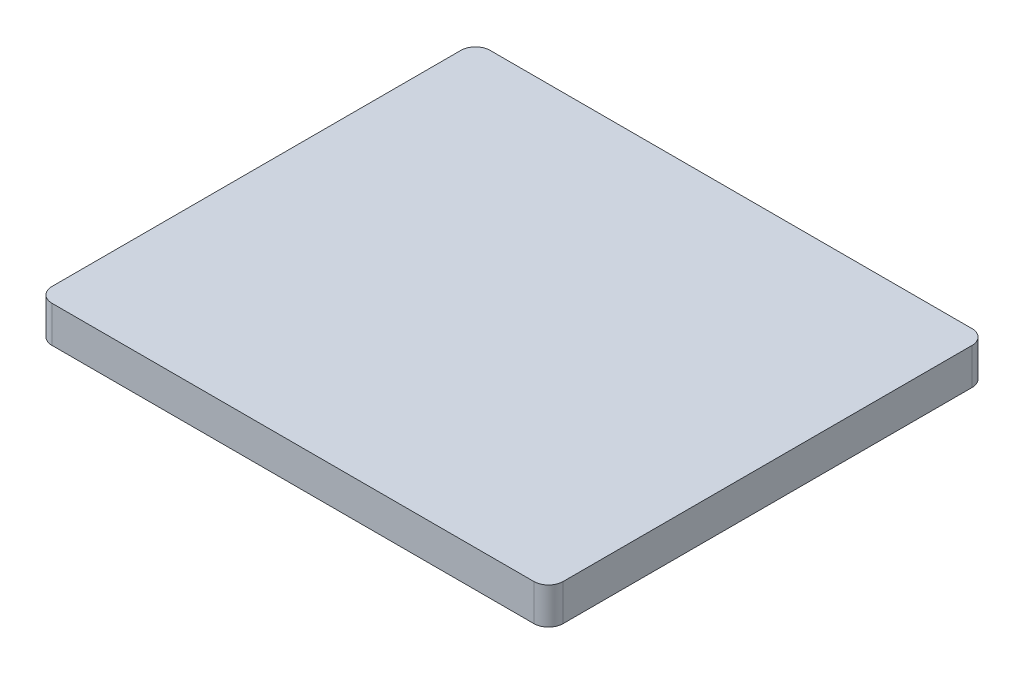
ISO-10303-21;
HEADER;
FILE_DESCRIPTION(('STEP AP214'),'2;1');
FILE_NAME('part.step','',(''),(''),'','','');
FILE_SCHEMA(('AUTOMOTIVE_DESIGN { 1 0 10303 214 1 1 1 1 }'));
ENDSEC;
DATA;
#1=APPLICATION_CONTEXT('core data for automotive mechanical design processes');
#2=APPLICATION_PROTOCOL_DEFINITION('international standard','automotive_design',2000,#1);
#3=PRODUCT_CONTEXT('',#1,'mechanical');
#4=PRODUCT('Part','Part','',(#3));
#5=PRODUCT_RELATED_PRODUCT_CATEGORY('part','',(#4));
#6=PRODUCT_DEFINITION_FORMATION('','',#4);
#7=PRODUCT_DEFINITION_CONTEXT('part definition',#1,'design');
#8=PRODUCT_DEFINITION('design','',#6,#7);
#9=PRODUCT_DEFINITION_SHAPE('','',#8);
#10=(LENGTH_UNIT() NAMED_UNIT(*) SI_UNIT(.MILLI.,.METRE.));
#11=(NAMED_UNIT(*) PLANE_ANGLE_UNIT() SI_UNIT($,.RADIAN.));
#12=(NAMED_UNIT(*) SI_UNIT($,.STERADIAN.) SOLID_ANGLE_UNIT());
#13=UNCERTAINTY_MEASURE_WITH_UNIT(LENGTH_MEASURE(1.E-05),#10,'distance_accuracy_value','');
#14=(GEOMETRIC_REPRESENTATION_CONTEXT(3) GLOBAL_UNCERTAINTY_ASSIGNED_CONTEXT((#13)) GLOBAL_UNIT_ASSIGNED_CONTEXT((#10,
#11,#12)) REPRESENTATION_CONTEXT('',''));
#15=CARTESIAN_POINT('',(0.,0.,0.));
#16=DIRECTION('',(0.,0.,1.));
#17=DIRECTION('',(1.,0.,0.));
#18=AXIS2_PLACEMENT_3D('',#15,#16,#17);
#19=CARTESIAN_POINT('',(0.,0.,0.));
#20=DIRECTION('',(0.,1.,0.));
#21=DIRECTION('',(0.,0.,1.));
#22=AXIS2_PLACEMENT_3D('',#19,#20,#21);
#23=PLANE('',#22);
#24=DIRECTION('',(1.,0.,0.));
#25=VECTOR('',#24,1.);
#26=CARTESIAN_POINT('',(0.,0.,30.));
#27=LINE('',#26,#25);
#28=CARTESIAN_POINT('',(-33.,0.,30.));
#29=VERTEX_POINT('',#28);
#30=CARTESIAN_POINT('',(33.,0.,30.));
#31=VERTEX_POINT('',#30);
#32=EDGE_CURVE('E319',#29,#31,#27,.T.);
#33=ORIENTED_EDGE('',*,*,#32,.F.);
#34=CARTESIAN_POINT('',(-33.,0.,28.));
#35=DIRECTION('',(0.,1.,0.));
#36=DIRECTION('',(0.,0.,1.));
#37=AXIS2_PLACEMENT_3D('',#34,#35,#36);
#38=CIRCLE('',#37,2.);
#39=CARTESIAN_POINT('',(-35.,0.,28.));
#40=VERTEX_POINT('',#39);
#41=EDGE_CURVE('E357',#29,#40,#38,.F.);
#42=ORIENTED_EDGE('',*,*,#41,.T.);
#43=DIRECTION('',(0.,0.,1.));
#44=VECTOR('',#43,1.);
#45=CARTESIAN_POINT('',(-35.,0.,0.));
#46=LINE('',#45,#44);
#47=CARTESIAN_POINT('',(-35.,0.,-28.));
#48=VERTEX_POINT('',#47);
#49=EDGE_CURVE('E330',#48,#40,#46,.T.);
#50=ORIENTED_EDGE('',*,*,#49,.F.);
#51=CARTESIAN_POINT('',(-33.,0.,-28.));
#52=DIRECTION('',(0.,1.,0.));
#53=DIRECTION('',(0.,0.,1.));
#54=AXIS2_PLACEMENT_3D('',#51,#52,#53);
#55=CIRCLE('',#54,2.);
#56=CARTESIAN_POINT('',(-33.,0.,-30.));
#57=VERTEX_POINT('',#56);
#58=EDGE_CURVE('E197',#48,#57,#55,.F.);
#59=ORIENTED_EDGE('',*,*,#58,.T.);
#60=DIRECTION('',(1.,0.,0.));
#61=VECTOR('',#60,1.);
#62=CARTESIAN_POINT('',(0.,0.,-30.));
#63=LINE('',#62,#61);
#64=CARTESIAN_POINT('',(33.,0.,-30.));
#65=VERTEX_POINT('',#64);
#66=EDGE_CURVE('E192',#57,#65,#63,.T.);
#67=ORIENTED_EDGE('',*,*,#66,.T.);
#68=CARTESIAN_POINT('',(33.,0.,-28.));
#69=DIRECTION('',(0.,1.,0.));
#70=DIRECTION('',(0.,0.,1.));
#71=AXIS2_PLACEMENT_3D('',#68,#69,#70);
#72=CIRCLE('',#71,2.);
#73=CARTESIAN_POINT('',(35.,0.,-28.));
#74=VERTEX_POINT('',#73);
#75=EDGE_CURVE('E186',#65,#74,#72,.F.);
#76=ORIENTED_EDGE('',*,*,#75,.T.);
#77=DIRECTION('',(0.,0.,1.));
#78=VECTOR('',#77,1.);
#79=CARTESIAN_POINT('',(35.,0.,0.));
#80=LINE('',#79,#78);
#81=CARTESIAN_POINT('',(35.,0.,28.));
#82=VERTEX_POINT('',#81);
#83=EDGE_CURVE('E190',#74,#82,#80,.T.);
#84=ORIENTED_EDGE('',*,*,#83,.T.);
#85=CARTESIAN_POINT('',(33.,0.,28.));
#86=DIRECTION('',(0.,1.,0.));
#87=DIRECTION('',(0.,0.,1.));
#88=AXIS2_PLACEMENT_3D('',#85,#86,#87);
#89=CIRCLE('',#88,2.);
#90=EDGE_CURVE('E355',#82,#31,#89,.F.);
#91=ORIENTED_EDGE('',*,*,#90,.T.);
#92=EDGE_LOOP('',(#33,#42,#50,#59,#67,#76,#84,#91));
#93=FACE_BOUND('',#92,.T.);
#94=CARTESIAN_POINT('',(12.5,0.,-2.5));
#95=DIRECTION('',(0.,1.,0.));
#96=DIRECTION('',(0.,0.,1.));
#97=AXIS2_PLACEMENT_3D('',#94,#95,#96);
#98=CIRCLE('',#97,4.);
#99=CARTESIAN_POINT('',(12.5,0.,-6.5));
#100=VERTEX_POINT('',#99);
#101=CARTESIAN_POINT('',(16.5,0.,-2.5));
#102=VERTEX_POINT('',#101);
#103=EDGE_CURVE('E198',#100,#102,#98,.F.);
#104=ORIENTED_EDGE('',*,*,#103,.F.);
#105=DIRECTION('',(-1.,0.,0.));
#106=VECTOR('',#105,1.);
#107=CARTESIAN_POINT('',(0.,0.,-6.5));
#108=LINE('',#107,#106);
#109=CARTESIAN_POINT('',(-12.5,0.,-6.5));
#110=VERTEX_POINT('',#109);
#111=EDGE_CURVE('E349',#100,#110,#108,.T.);
#112=ORIENTED_EDGE('',*,*,#111,.T.);
#113=CARTESIAN_POINT('',(-12.5,0.,-2.5));
#114=DIRECTION('',(0.,1.,0.));
#115=DIRECTION('',(0.,0.,1.));
#116=AXIS2_PLACEMENT_3D('',#113,#114,#115);
#117=CIRCLE('',#116,4.);
#118=CARTESIAN_POINT('',(-16.5,0.,-2.5));
#119=VERTEX_POINT('',#118);
#120=EDGE_CURVE('E346',#119,#110,#117,.F.);
#121=ORIENTED_EDGE('',*,*,#120,.F.);
#122=DIRECTION('',(0.,0.,1.));
#123=VECTOR('',#122,1.);
#124=CARTESIAN_POINT('',(-16.5,0.,0.));
#125=LINE('',#124,#123);
#126=CARTESIAN_POINT('',(-16.5,0.,2.5));
#127=VERTEX_POINT('',#126);
#128=EDGE_CURVE('E342',#119,#127,#125,.T.);
#129=ORIENTED_EDGE('',*,*,#128,.T.);
#130=CARTESIAN_POINT('',(-12.5,0.,2.5));
#131=DIRECTION('',(0.,1.,0.));
#132=DIRECTION('',(0.,0.,1.));
#133=AXIS2_PLACEMENT_3D('',#130,#131,#132);
#134=CIRCLE('',#133,4.);
#135=CARTESIAN_POINT('',(-12.5,0.,6.5));
#136=VERTEX_POINT('',#135);
#137=EDGE_CURVE('E339',#136,#127,#134,.F.);
#138=ORIENTED_EDGE('',*,*,#137,.F.);
#139=DIRECTION('',(1.,0.,0.));
#140=VECTOR('',#139,1.);
#141=CARTESIAN_POINT('',(0.,0.,6.5));
#142=LINE('',#141,#140);
#143=CARTESIAN_POINT('',(12.5,0.,6.5));
#144=VERTEX_POINT('',#143);
#145=EDGE_CURVE('E337',#136,#144,#142,.T.);
#146=ORIENTED_EDGE('',*,*,#145,.T.);
#147=CARTESIAN_POINT('',(12.5,0.,2.5));
#148=DIRECTION('',(0.,1.,0.));
#149=DIRECTION('',(0.,0.,1.));
#150=AXIS2_PLACEMENT_3D('',#147,#148,#149);
#151=CIRCLE('',#150,4.);
#152=CARTESIAN_POINT('',(16.5,0.,2.5));
#153=VERTEX_POINT('',#152);
#154=EDGE_CURVE('E327',#153,#144,#151,.F.);
#155=ORIENTED_EDGE('',*,*,#154,.F.);
#156=DIRECTION('',(0.,0.,-1.));
#157=VECTOR('',#156,1.);
#158=CARTESIAN_POINT('',(16.5,0.,0.));
#159=LINE('',#158,#157);
#160=EDGE_CURVE('E344',#153,#102,#159,.T.);
#161=ORIENTED_EDGE('',*,*,#160,.T.);
#162=EDGE_LOOP('',(#104,#112,#121,#129,#138,#146,#155,#161));
#163=FACE_BOUND('',#162,.T.);
#164=ADVANCED_FACE('F38',(#93,#163),#23,.F.);
#165=CARTESIAN_POINT('',(35.,5.,0.));
#166=DIRECTION('',(1.,0.,0.));
#167=DIRECTION('',(0.,0.,-1.));
#168=AXIS2_PLACEMENT_3D('',#165,#166,#167);
#169=PLANE('',#168);
#170=DIRECTION('',(0.,0.,1.));
#171=VECTOR('',#170,1.);
#172=CARTESIAN_POINT('',(35.,5.,0.));
#173=LINE('',#172,#171);
#174=CARTESIAN_POINT('',(35.,5.,-28.));
#175=VERTEX_POINT('',#174);
#176=CARTESIAN_POINT('',(35.,5.,28.));
#177=VERTEX_POINT('',#176);
#178=EDGE_CURVE('E316',#175,#177,#173,.T.);
#179=ORIENTED_EDGE('',*,*,#178,.T.);
#180=DIRECTION('',(0.,-1.,0.));
#181=VECTOR('',#180,1.);
#182=CARTESIAN_POINT('',(35.,0.,28.));
#183=LINE('',#182,#181);
#184=EDGE_CURVE('E207',#177,#82,#183,.T.);
#185=ORIENTED_EDGE('',*,*,#184,.T.);
#186=ORIENTED_EDGE('',*,*,#83,.F.);
#187=DIRECTION('',(0.,-1.,0.));
#188=VECTOR('',#187,1.);
#189=CARTESIAN_POINT('',(35.,5.,-28.));
#190=LINE('',#189,#188);
#191=EDGE_CURVE('E204',#74,#175,#190,.F.);
#192=ORIENTED_EDGE('',*,*,#191,.T.);
#193=EDGE_LOOP('',(#179,#185,#186,#192));
#194=FACE_BOUND('',#193,.T.);
#195=ADVANCED_FACE('F203',(#194),#169,.T.);
#196=CARTESIAN_POINT('',(0.,5.,-30.));
#197=DIRECTION('',(0.,0.,-1.));
#198=DIRECTION('',(-1.,0.,0.));
#199=AXIS2_PLACEMENT_3D('',#196,#197,#198);
#200=PLANE('',#199);
#201=ORIENTED_EDGE('',*,*,#66,.F.);
#202=DIRECTION('',(0.,-1.,0.));
#203=VECTOR('',#202,1.);
#204=CARTESIAN_POINT('',(-33.,5.,-30.));
#205=LINE('',#204,#203);
#206=CARTESIAN_POINT('',(-33.,5.,-30.));
#207=VERTEX_POINT('',#206);
#208=EDGE_CURVE('E221',#57,#207,#205,.F.);
#209=ORIENTED_EDGE('',*,*,#208,.T.);
#210=DIRECTION('',(1.,0.,0.));
#211=VECTOR('',#210,1.);
#212=CARTESIAN_POINT('',(0.,5.,-30.));
#213=LINE('',#212,#211);
#214=CARTESIAN_POINT('',(33.,5.,-30.));
#215=VERTEX_POINT('',#214);
#216=EDGE_CURVE('E318',#207,#215,#213,.T.);
#217=ORIENTED_EDGE('',*,*,#216,.T.);
#218=DIRECTION('',(0.,-1.,0.));
#219=VECTOR('',#218,1.);
#220=CARTESIAN_POINT('',(33.,5.,-30.));
#221=LINE('',#220,#219);
#222=EDGE_CURVE('E214',#215,#65,#221,.T.);
#223=ORIENTED_EDGE('',*,*,#222,.T.);
#224=EDGE_LOOP('',(#201,#209,#217,#223));
#225=FACE_BOUND('',#224,.T.);
#226=ADVANCED_FACE('F422',(#225),#200,.T.);
#227=CARTESIAN_POINT('',(-35.,5.,0.));
#228=DIRECTION('',(1.,0.,0.));
#229=DIRECTION('',(0.,0.,-1.));
#230=AXIS2_PLACEMENT_3D('',#227,#228,#229);
#231=PLANE('',#230);
#232=ORIENTED_EDGE('',*,*,#49,.T.);
#233=DIRECTION('',(0.,-1.,0.));
#234=VECTOR('',#233,1.);
#235=CARTESIAN_POINT('',(-35.,5.,28.));
#236=LINE('',#235,#234);
#237=CARTESIAN_POINT('',(-35.,5.,28.));
#238=VERTEX_POINT('',#237);
#239=EDGE_CURVE('E394',#40,#238,#236,.F.);
#240=ORIENTED_EDGE('',*,*,#239,.T.);
#241=DIRECTION('',(0.,0.,1.));
#242=VECTOR('',#241,1.);
#243=CARTESIAN_POINT('',(-35.,5.,0.));
#244=LINE('',#243,#242);
#245=CARTESIAN_POINT('',(-35.,5.,-28.));
#246=VERTEX_POINT('',#245);
#247=EDGE_CURVE('E322',#246,#238,#244,.T.);
#248=ORIENTED_EDGE('',*,*,#247,.F.);
#249=DIRECTION('',(0.,-1.,0.));
#250=VECTOR('',#249,1.);
#251=CARTESIAN_POINT('',(-35.,0.,-28.));
#252=LINE('',#251,#250);
#253=EDGE_CURVE('E391',#246,#48,#252,.T.);
#254=ORIENTED_EDGE('',*,*,#253,.T.);
#255=EDGE_LOOP('',(#232,#240,#248,#254));
#256=FACE_BOUND('',#255,.T.);
#257=ADVANCED_FACE('F414',(#256),#231,.F.);
#258=CARTESIAN_POINT('',(0.,5.,30.));
#259=DIRECTION('',(0.,0.,-1.));
#260=DIRECTION('',(-1.,0.,0.));
#261=AXIS2_PLACEMENT_3D('',#258,#259,#260);
#262=PLANE('',#261);
#263=DIRECTION('',(1.,0.,0.));
#264=VECTOR('',#263,1.);
#265=CARTESIAN_POINT('',(0.,5.,30.));
#266=LINE('',#265,#264);
#267=CARTESIAN_POINT('',(-33.,5.,30.));
#268=VERTEX_POINT('',#267);
#269=CARTESIAN_POINT('',(33.,5.,30.));
#270=VERTEX_POINT('',#269);
#271=EDGE_CURVE('E325',#268,#270,#266,.T.);
#272=ORIENTED_EDGE('',*,*,#271,.F.);
#273=DIRECTION('',(0.,-1.,0.));
#274=VECTOR('',#273,1.);
#275=CARTESIAN_POINT('',(-33.,5.,30.));
#276=LINE('',#275,#274);
#277=EDGE_CURVE('E388',#268,#29,#276,.T.);
#278=ORIENTED_EDGE('',*,*,#277,.T.);
#279=ORIENTED_EDGE('',*,*,#32,.T.);
#280=DIRECTION('',(0.,-1.,0.));
#281=VECTOR('',#280,1.);
#282=CARTESIAN_POINT('',(33.,5.,30.));
#283=LINE('',#282,#281);
#284=EDGE_CURVE('E386',#31,#270,#283,.F.);
#285=ORIENTED_EDGE('',*,*,#284,.T.);
#286=EDGE_LOOP('',(#272,#278,#279,#285));
#287=FACE_BOUND('',#286,.T.);
#288=ADVANCED_FACE('F406',(#287),#262,.F.);
#289=CARTESIAN_POINT('',(0.,5.,0.));
#290=DIRECTION('',(0.,1.,0.));
#291=DIRECTION('',(0.,0.,1.));
#292=AXIS2_PLACEMENT_3D('',#289,#290,#291);
#293=PLANE('',#292);
#294=ORIENTED_EDGE('',*,*,#247,.T.);
#295=CARTESIAN_POINT('',(-33.,5.,28.));
#296=DIRECTION('',(0.,1.,0.));
#297=DIRECTION('',(0.,0.,1.));
#298=AXIS2_PLACEMENT_3D('',#295,#296,#297);
#299=CIRCLE('',#298,2.);
#300=EDGE_CURVE('E212',#238,#268,#299,.T.);
#301=ORIENTED_EDGE('',*,*,#300,.T.);
#302=ORIENTED_EDGE('',*,*,#271,.T.);
#303=CARTESIAN_POINT('',(33.,5.,28.));
#304=DIRECTION('',(0.,1.,0.));
#305=DIRECTION('',(0.,0.,1.));
#306=AXIS2_PLACEMENT_3D('',#303,#304,#305);
#307=CIRCLE('',#306,2.);
#308=EDGE_CURVE('E216',#270,#177,#307,.T.);
#309=ORIENTED_EDGE('',*,*,#308,.T.);
#310=ORIENTED_EDGE('',*,*,#178,.F.);
#311=CARTESIAN_POINT('',(33.,5.,-28.));
#312=DIRECTION('',(0.,1.,0.));
#313=DIRECTION('',(0.,0.,1.));
#314=AXIS2_PLACEMENT_3D('',#311,#312,#313);
#315=CIRCLE('',#314,2.);
#316=EDGE_CURVE('E211',#175,#215,#315,.T.);
#317=ORIENTED_EDGE('',*,*,#316,.T.);
#318=ORIENTED_EDGE('',*,*,#216,.F.);
#319=CARTESIAN_POINT('',(-33.,5.,-28.));
#320=DIRECTION('',(0.,1.,0.));
#321=DIRECTION('',(0.,0.,1.));
#322=AXIS2_PLACEMENT_3D('',#319,#320,#321);
#323=CIRCLE('',#322,2.);
#324=EDGE_CURVE('E397',#207,#246,#323,.T.);
#325=ORIENTED_EDGE('',*,*,#324,.T.);
#326=EDGE_LOOP('',(#294,#301,#302,#309,#310,#317,#318,#325));
#327=FACE_BOUND('',#326,.T.);
#328=ADVANCED_FACE('F400',(#327),#293,.T.);
#329=CARTESIAN_POINT('',(-14.5,-20.,-4.5));
#330=DIRECTION('',(-1.,0.,0.));
#331=DIRECTION('',(0.,0.,1.));
#332=AXIS2_PLACEMENT_3D('',#329,#330,#331);
#333=PLANE('',#332);
#334=DIRECTION('',(0.,0.,1.));
#335=VECTOR('',#334,1.);
#336=CARTESIAN_POINT('',(-14.5,-2.,-4.5));
#337=LINE('',#336,#335);
#338=CARTESIAN_POINT('',(-14.5,-2.,2.5));
#339=VERTEX_POINT('',#338);
#340=CARTESIAN_POINT('',(-14.5,-2.,-2.5));
#341=VERTEX_POINT('',#340);
#342=EDGE_CURVE('E381',#339,#341,#337,.F.);
#343=ORIENTED_EDGE('',*,*,#342,.T.);
#344=DIRECTION('',(0.,1.,0.));
#345=VECTOR('',#344,1.);
#346=CARTESIAN_POINT('',(-14.5,-20.,-2.5));
#347=LINE('',#346,#345);
#348=CARTESIAN_POINT('',(-14.5,-18.,-2.5));
#349=VERTEX_POINT('',#348);
#350=EDGE_CURVE('E384',#341,#349,#347,.F.);
#351=ORIENTED_EDGE('',*,*,#350,.T.);
#352=DIRECTION('',(0.,0.,1.));
#353=VECTOR('',#352,1.);
#354=CARTESIAN_POINT('',(-14.5,-18.,-4.5));
#355=LINE('',#354,#353);
#356=CARTESIAN_POINT('',(-14.5,-18.,2.5));
#357=VERTEX_POINT('',#356);
#358=EDGE_CURVE('E379',#349,#357,#355,.T.);
#359=ORIENTED_EDGE('',*,*,#358,.T.);
#360=DIRECTION('',(0.,1.,0.));
#361=VECTOR('',#360,1.);
#362=CARTESIAN_POINT('',(-14.5,-20.,2.5));
#363=LINE('',#362,#361);
#364=EDGE_CURVE('E377',#357,#339,#363,.T.);
#365=ORIENTED_EDGE('',*,*,#364,.T.);
#366=EDGE_LOOP('',(#343,#351,#359,#365));
#367=FACE_BOUND('',#366,.T.);
#368=ADVANCED_FACE('F443',(#367),#333,.T.);
#369=CARTESIAN_POINT('',(14.5,-20.,-4.5));
#370=DIRECTION('',(0.,0.,-1.));
#371=DIRECTION('',(-1.,0.,0.));
#372=AXIS2_PLACEMENT_3D('',#369,#370,#371);
#373=PLANE('',#372);
#374=DIRECTION('',(-1.,0.,0.));
#375=VECTOR('',#374,1.);
#376=CARTESIAN_POINT('',(14.5,-2.,-4.5));
#377=LINE('',#376,#375);
#378=CARTESIAN_POINT('',(-12.5,-2.,-4.5));
#379=VERTEX_POINT('',#378);
#380=CARTESIAN_POINT('',(12.5,-2.,-4.5));
#381=VERTEX_POINT('',#380);
#382=EDGE_CURVE('E363',#379,#381,#377,.F.);
#383=ORIENTED_EDGE('',*,*,#382,.T.);
#384=DIRECTION('',(0.,1.,0.));
#385=VECTOR('',#384,1.);
#386=CARTESIAN_POINT('',(12.5,-20.,-4.5));
#387=LINE('',#386,#385);
#388=CARTESIAN_POINT('',(12.5,-18.,-4.5));
#389=VERTEX_POINT('',#388);
#390=EDGE_CURVE('E366',#381,#389,#387,.F.);
#391=ORIENTED_EDGE('',*,*,#390,.T.);
#392=DIRECTION('',(-1.,0.,0.));
#393=VECTOR('',#392,1.);
#394=CARTESIAN_POINT('',(14.5,-18.,-4.5));
#395=LINE('',#394,#393);
#396=CARTESIAN_POINT('',(-12.5,-18.,-4.5));
#397=VERTEX_POINT('',#396);
#398=EDGE_CURVE('E361',#389,#397,#395,.T.);
#399=ORIENTED_EDGE('',*,*,#398,.T.);
#400=DIRECTION('',(0.,1.,0.));
#401=VECTOR('',#400,1.);
#402=CARTESIAN_POINT('',(-12.5,-20.,-4.5));
#403=LINE('',#402,#401);
#404=EDGE_CURVE('E359',#397,#379,#403,.T.);
#405=ORIENTED_EDGE('',*,*,#404,.T.);
#406=EDGE_LOOP('',(#383,#391,#399,#405));
#407=FACE_BOUND('',#406,.T.);
#408=CARTESIAN_POINT('',(0.,-12.,-4.5));
#409=DIRECTION('',(0.,0.,-1.));
#410=DIRECTION('',(-1.,0.,0.));
#411=AXIS2_PLACEMENT_3D('',#408,#409,#410);
#412=CIRCLE('',#411,5.5);
#413=CARTESIAN_POINT('',(-5.5,-12.,-4.5));
#414=VERTEX_POINT('',#413);
#415=EDGE_CURVE('E208',#414,#414,#412,.T.);
#416=ORIENTED_EDGE('',*,*,#415,.F.);
#417=EDGE_LOOP('',(#416));
#418=FACE_BOUND('',#417,.T.);
#419=ADVANCED_FACE('F447',(#407,#418),#373,.T.);
#420=CARTESIAN_POINT('',(14.5,-20.,-4.5));
#421=DIRECTION('',(1.,0.,0.));
#422=DIRECTION('',(0.,0.,-1.));
#423=AXIS2_PLACEMENT_3D('',#420,#421,#422);
#424=PLANE('',#423);
#425=DIRECTION('',(0.,1.,0.));
#426=VECTOR('',#425,1.);
#427=CARTESIAN_POINT('',(14.5,-20.,-2.5));
#428=LINE('',#427,#426);
#429=CARTESIAN_POINT('',(14.5,-18.,-2.5));
#430=VERTEX_POINT('',#429);
#431=CARTESIAN_POINT('',(14.5,-2.,-2.5));
#432=VERTEX_POINT('',#431);
#433=EDGE_CURVE('E370',#430,#432,#428,.T.);
#434=ORIENTED_EDGE('',*,*,#433,.T.);
#435=DIRECTION('',(0.,0.,-1.));
#436=VECTOR('',#435,1.);
#437=CARTESIAN_POINT('',(14.5,-2.,-4.5));
#438=LINE('',#437,#436);
#439=CARTESIAN_POINT('',(14.5,-2.,2.5));
#440=VERTEX_POINT('',#439);
#441=EDGE_CURVE('E374',#432,#440,#438,.F.);
#442=ORIENTED_EDGE('',*,*,#441,.T.);
#443=DIRECTION('',(0.,1.,0.));
#444=VECTOR('',#443,1.);
#445=CARTESIAN_POINT('',(14.5,-20.,2.5));
#446=LINE('',#445,#444);
#447=CARTESIAN_POINT('',(14.5,-18.,2.5));
#448=VERTEX_POINT('',#447);
#449=EDGE_CURVE('E372',#440,#448,#446,.F.);
#450=ORIENTED_EDGE('',*,*,#449,.T.);
#451=DIRECTION('',(0.,0.,-1.));
#452=VECTOR('',#451,1.);
#453=CARTESIAN_POINT('',(14.5,-18.,-4.5));
#454=LINE('',#453,#452);
#455=EDGE_CURVE('E368',#448,#430,#454,.T.);
#456=ORIENTED_EDGE('',*,*,#455,.T.);
#457=EDGE_LOOP('',(#434,#442,#450,#456));
#458=FACE_BOUND('',#457,.T.);
#459=ADVANCED_FACE('F452',(#458),#424,.T.);
#460=CARTESIAN_POINT('',(14.5,-20.,4.5));
#461=DIRECTION('',(0.,0.,1.));
#462=DIRECTION('',(1.,0.,0.));
#463=AXIS2_PLACEMENT_3D('',#460,#461,#462);
#464=PLANE('',#463);
#465=DIRECTION('',(0.,1.,0.));
#466=VECTOR('',#465,1.);
#467=CARTESIAN_POINT('',(-12.5,-20.,4.5));
#468=LINE('',#467,#466);
#469=CARTESIAN_POINT('',(-12.5,-2.,4.5));
#470=VERTEX_POINT('',#469);
#471=CARTESIAN_POINT('',(-12.5,-18.,4.5));
#472=VERTEX_POINT('',#471);
#473=EDGE_CURVE('E223',#470,#472,#468,.F.);
#474=ORIENTED_EDGE('',*,*,#473,.T.);
#475=DIRECTION('',(1.,0.,0.));
#476=VECTOR('',#475,1.);
#477=CARTESIAN_POINT('',(14.5,-18.,4.5));
#478=LINE('',#477,#476);
#479=CARTESIAN_POINT('',(12.5,-18.,4.5));
#480=VERTEX_POINT('',#479);
#481=EDGE_CURVE('E229',#472,#480,#478,.T.);
#482=ORIENTED_EDGE('',*,*,#481,.T.);
#483=DIRECTION('',(0.,1.,0.));
#484=VECTOR('',#483,1.);
#485=CARTESIAN_POINT('',(12.5,-20.,4.5));
#486=LINE('',#485,#484);
#487=CARTESIAN_POINT('',(12.5,-2.,4.5));
#488=VERTEX_POINT('',#487);
#489=EDGE_CURVE('E227',#480,#488,#486,.T.);
#490=ORIENTED_EDGE('',*,*,#489,.T.);
#491=DIRECTION('',(1.,0.,0.));
#492=VECTOR('',#491,1.);
#493=CARTESIAN_POINT('',(14.5,-2.,4.5));
#494=LINE('',#493,#492);
#495=EDGE_CURVE('E225',#488,#470,#494,.F.);
#496=ORIENTED_EDGE('',*,*,#495,.T.);
#497=EDGE_LOOP('',(#474,#482,#490,#496));
#498=FACE_BOUND('',#497,.T.);
#499=CARTESIAN_POINT('',(0.,-12.,4.5));
#500=DIRECTION('',(0.,0.,1.));
#501=DIRECTION('',(1.,0.,0.));
#502=AXIS2_PLACEMENT_3D('',#499,#500,#501);
#503=CIRCLE('',#502,5.5);
#504=CARTESIAN_POINT('',(5.5,-12.,4.5));
#505=VERTEX_POINT('',#504);
#506=EDGE_CURVE('E304',#505,#505,#503,.T.);
#507=ORIENTED_EDGE('',*,*,#506,.F.);
#508=EDGE_LOOP('',(#507));
#509=FACE_BOUND('',#508,.T.);
#510=ADVANCED_FACE('F456',(#498,#509),#464,.T.);
#511=CARTESIAN_POINT('',(0.,-20.,0.));
#512=DIRECTION('',(0.,-1.,0.));
#513=DIRECTION('',(0.,0.,-1.));
#514=AXIS2_PLACEMENT_3D('',#511,#512,#513);
#515=PLANE('',#514);
#516=DIRECTION('',(-1.,0.,0.));
#517=VECTOR('',#516,1.);
#518=CARTESIAN_POINT('',(0.,-20.,-2.5));
#519=LINE('',#518,#517);
#520=CARTESIAN_POINT('',(-12.5,-20.,-2.5));
#521=VERTEX_POINT('',#520);
#522=CARTESIAN_POINT('',(12.5,-20.,-2.5));
#523=VERTEX_POINT('',#522);
#524=EDGE_CURVE('E58',#521,#523,#519,.F.);
#525=ORIENTED_EDGE('',*,*,#524,.T.);
#526=DIRECTION('',(0.,0.,-1.));
#527=VECTOR('',#526,1.);
#528=CARTESIAN_POINT('',(12.5,-20.,0.));
#529=LINE('',#528,#527);
#530=CARTESIAN_POINT('',(12.5,-20.,2.5));
#531=VERTEX_POINT('',#530);
#532=EDGE_CURVE('E11',#523,#531,#529,.F.);
#533=ORIENTED_EDGE('',*,*,#532,.T.);
#534=DIRECTION('',(1.,0.,0.));
#535=VECTOR('',#534,1.);
#536=CARTESIAN_POINT('',(0.,-20.,2.5));
#537=LINE('',#536,#535);
#538=CARTESIAN_POINT('',(-12.5,-20.,2.5));
#539=VERTEX_POINT('',#538);
#540=EDGE_CURVE('E47',#531,#539,#537,.F.);
#541=ORIENTED_EDGE('',*,*,#540,.T.);
#542=DIRECTION('',(0.,0.,1.));
#543=VECTOR('',#542,1.);
#544=CARTESIAN_POINT('',(-12.5,-20.,0.));
#545=LINE('',#544,#543);
#546=EDGE_CURVE('E232',#539,#521,#545,.F.);
#547=ORIENTED_EDGE('',*,*,#546,.T.);
#548=EDGE_LOOP('',(#525,#533,#541,#547));
#549=FACE_BOUND('',#548,.T.);
#550=ADVANCED_FACE('F459',(#549),#515,.T.);
#551=CARTESIAN_POINT('',(0.,-12.,-30.));
#552=DIRECTION('',(0.,0.,1.));
#553=DIRECTION('',(1.,0.,0.));
#554=AXIS2_PLACEMENT_3D('',#551,#552,#553);
#555=CYLINDRICAL_SURFACE('',#554,5.5);
#556=ORIENTED_EDGE('',*,*,#415,.T.);
#557=EDGE_LOOP('',(#556));
#558=FACE_BOUND('',#557,.T.);
#559=ORIENTED_EDGE('',*,*,#506,.T.);
#560=EDGE_LOOP('',(#559));
#561=FACE_BOUND('',#560,.T.);
#562=ADVANCED_FACE('F466',(#558,#561),#555,.F.);
#563=CARTESIAN_POINT('',(14.5,-18.,2.5));
#564=DIRECTION('',(1.,0.,0.));
#565=DIRECTION('',(0.,0.,-1.));
#566=AXIS2_PLACEMENT_3D('',#563,#564,#565);
#567=CYLINDRICAL_SURFACE('',#566,2.);
#568=CARTESIAN_POINT('',(12.5,-18.,2.5));
#569=DIRECTION('',(1.,0.,0.));
#570=DIRECTION('',(0.,0.,-1.));
#571=AXIS2_PLACEMENT_3D('',#568,#569,#570);
#572=CIRCLE('',#571,2.);
#573=EDGE_CURVE('E42',#480,#531,#572,.T.);
#574=ORIENTED_EDGE('',*,*,#573,.F.);
#575=ORIENTED_EDGE('',*,*,#481,.F.);
#576=CARTESIAN_POINT('',(-12.5,-18.,2.5));
#577=DIRECTION('',(-1.,0.,0.));
#578=DIRECTION('',(0.,0.,1.));
#579=AXIS2_PLACEMENT_3D('',#576,#577,#578);
#580=CIRCLE('',#579,2.);
#581=EDGE_CURVE('E297',#539,#472,#580,.T.);
#582=ORIENTED_EDGE('',*,*,#581,.F.);
#583=ORIENTED_EDGE('',*,*,#540,.F.);
#584=EDGE_LOOP('',(#574,#575,#582,#583));
#585=FACE_BOUND('',#584,.T.);
#586=ADVANCED_FACE('F468',(#585),#567,.T.);
#587=CARTESIAN_POINT('',(12.5,-18.,2.5));
#588=DIRECTION('',(0.,0.,1.));
#589=DIRECTION('',(1.,0.,0.));
#590=AXIS2_PLACEMENT_3D('',#587,#588,#589);
#591=SPHERICAL_SURFACE('',#590,2.);
#592=CARTESIAN_POINT('',(12.5,-18.,2.5));
#593=DIRECTION('',(0.,-1.,0.));
#594=DIRECTION('',(0.,0.,-1.));
#595=AXIS2_PLACEMENT_3D('',#592,#593,#594);
#596=CIRCLE('',#595,2.);
#597=EDGE_CURVE('E292',#480,#448,#596,.F.);
#598=ORIENTED_EDGE('',*,*,#597,.F.);
#599=ORIENTED_EDGE('',*,*,#573,.T.);
#600=CARTESIAN_POINT('',(12.5,-18.,2.5));
#601=DIRECTION('',(0.,0.,1.));
#602=DIRECTION('',(1.,0.,0.));
#603=AXIS2_PLACEMENT_3D('',#600,#601,#602);
#604=CIRCLE('',#603,2.);
#605=EDGE_CURVE('E295',#448,#531,#604,.F.);
#606=ORIENTED_EDGE('',*,*,#605,.F.);
#607=EDGE_LOOP('',(#598,#599,#606));
#608=FACE_BOUND('',#607,.T.);
#609=ADVANCED_FACE('F473',(#608),#591,.T.);
#610=CARTESIAN_POINT('',(-12.5,-18.,2.5));
#611=DIRECTION('',(0.,0.,1.));
#612=DIRECTION('',(1.,0.,0.));
#613=AXIS2_PLACEMENT_3D('',#610,#611,#612);
#614=SPHERICAL_SURFACE('',#613,2.);
#615=CARTESIAN_POINT('',(-12.5,-18.,2.5));
#616=DIRECTION('',(0.,0.,1.));
#617=DIRECTION('',(1.,0.,0.));
#618=AXIS2_PLACEMENT_3D('',#615,#616,#617);
#619=CIRCLE('',#618,2.);
#620=EDGE_CURVE('E286',#539,#357,#619,.F.);
#621=ORIENTED_EDGE('',*,*,#620,.F.);
#622=ORIENTED_EDGE('',*,*,#581,.T.);
#623=CARTESIAN_POINT('',(-12.5,-18.,2.5));
#624=DIRECTION('',(0.,-1.,0.));
#625=DIRECTION('',(0.,0.,-1.));
#626=AXIS2_PLACEMENT_3D('',#623,#624,#625);
#627=CIRCLE('',#626,2.);
#628=EDGE_CURVE('E289',#357,#472,#627,.F.);
#629=ORIENTED_EDGE('',*,*,#628,.F.);
#630=EDGE_LOOP('',(#621,#622,#629));
#631=FACE_BOUND('',#630,.T.);
#632=ADVANCED_FACE('F481',(#631),#614,.T.);
#633=CARTESIAN_POINT('',(12.5,-18.,-4.5));
#634=DIRECTION('',(0.,0.,-1.));
#635=DIRECTION('',(-1.,0.,0.));
#636=AXIS2_PLACEMENT_3D('',#633,#634,#635);
#637=CYLINDRICAL_SURFACE('',#636,2.);
#638=ORIENTED_EDGE('',*,*,#605,.T.);
#639=ORIENTED_EDGE('',*,*,#532,.F.);
#640=CARTESIAN_POINT('',(12.5,-18.,-2.5));
#641=DIRECTION('',(0.,0.,-1.));
#642=DIRECTION('',(-1.,0.,0.));
#643=AXIS2_PLACEMENT_3D('',#640,#641,#642);
#644=CIRCLE('',#643,2.);
#645=EDGE_CURVE('E280',#430,#523,#644,.T.);
#646=ORIENTED_EDGE('',*,*,#645,.F.);
#647=ORIENTED_EDGE('',*,*,#455,.F.);
#648=EDGE_LOOP('',(#638,#639,#646,#647));
#649=FACE_BOUND('',#648,.T.);
#650=ADVANCED_FACE('F673',(#649),#637,.T.);
#651=CARTESIAN_POINT('',(12.5,-20.,2.5));
#652=DIRECTION('',(0.,1.,0.));
#653=DIRECTION('',(0.,0.,1.));
#654=AXIS2_PLACEMENT_3D('',#651,#652,#653);
#655=CYLINDRICAL_SURFACE('',#654,2.);
#656=ORIENTED_EDGE('',*,*,#597,.T.);
#657=ORIENTED_EDGE('',*,*,#449,.F.);
#658=CARTESIAN_POINT('',(12.5,-2.,2.5));
#659=DIRECTION('',(0.,1.,0.));
#660=DIRECTION('',(0.,0.,1.));
#661=AXIS2_PLACEMENT_3D('',#658,#659,#660);
#662=CIRCLE('',#661,2.);
#663=EDGE_CURVE('E277',#488,#440,#662,.T.);
#664=ORIENTED_EDGE('',*,*,#663,.F.);
#665=ORIENTED_EDGE('',*,*,#489,.F.);
#666=EDGE_LOOP('',(#656,#657,#664,#665));
#667=FACE_BOUND('',#666,.T.);
#668=ADVANCED_FACE('F663',(#667),#655,.T.);
#669=CARTESIAN_POINT('',(0.,-2.,6.5));
#670=DIRECTION('',(1.,0.,0.));
#671=DIRECTION('',(0.,0.,-1.));
#672=AXIS2_PLACEMENT_3D('',#669,#670,#671);
#673=CYLINDRICAL_SURFACE('',#672,2.);
#674=CARTESIAN_POINT('',(-12.5,-2.,6.5));
#675=DIRECTION('',(1.,0.,0.));
#676=DIRECTION('',(0.,0.,-1.));
#677=AXIS2_PLACEMENT_3D('',#674,#675,#676);
#678=CIRCLE('',#677,2.);
#679=EDGE_CURVE('E271',#470,#136,#678,.T.);
#680=ORIENTED_EDGE('',*,*,#679,.F.);
#681=ORIENTED_EDGE('',*,*,#495,.F.);
#682=CARTESIAN_POINT('',(12.5,-2.,6.5));
#683=DIRECTION('',(-1.,0.,0.));
#684=DIRECTION('',(0.,0.,1.));
#685=AXIS2_PLACEMENT_3D('',#682,#683,#684);
#686=CIRCLE('',#685,2.);
#687=EDGE_CURVE('E274',#144,#488,#686,.T.);
#688=ORIENTED_EDGE('',*,*,#687,.F.);
#689=ORIENTED_EDGE('',*,*,#145,.F.);
#690=EDGE_LOOP('',(#680,#681,#688,#689));
#691=FACE_BOUND('',#690,.T.);
#692=ADVANCED_FACE('F653',(#691),#673,.F.);
#693=CARTESIAN_POINT('',(-12.5,-20.,2.5));
#694=DIRECTION('',(0.,1.,0.));
#695=DIRECTION('',(0.,0.,1.));
#696=AXIS2_PLACEMENT_3D('',#693,#694,#695);
#697=CYLINDRICAL_SURFACE('',#696,2.);
#698=ORIENTED_EDGE('',*,*,#628,.T.);
#699=ORIENTED_EDGE('',*,*,#473,.F.);
#700=CARTESIAN_POINT('',(-12.5,-2.,2.5));
#701=DIRECTION('',(0.,1.,0.));
#702=DIRECTION('',(0.,0.,1.));
#703=AXIS2_PLACEMENT_3D('',#700,#701,#702);
#704=CIRCLE('',#703,2.);
#705=EDGE_CURVE('E268',#339,#470,#704,.T.);
#706=ORIENTED_EDGE('',*,*,#705,.F.);
#707=ORIENTED_EDGE('',*,*,#364,.F.);
#708=EDGE_LOOP('',(#698,#699,#706,#707));
#709=FACE_BOUND('',#708,.T.);
#710=ADVANCED_FACE('F643',(#709),#697,.T.);
#711=CARTESIAN_POINT('',(-12.5,-18.,-4.5));
#712=DIRECTION('',(0.,0.,1.));
#713=DIRECTION('',(1.,0.,0.));
#714=AXIS2_PLACEMENT_3D('',#711,#712,#713);
#715=CYLINDRICAL_SURFACE('',#714,2.);
#716=ORIENTED_EDGE('',*,*,#620,.T.);
#717=ORIENTED_EDGE('',*,*,#358,.F.);
#718=CARTESIAN_POINT('',(-12.5,-18.,-2.5));
#719=DIRECTION('',(0.,0.,-1.));
#720=DIRECTION('',(-1.,0.,0.));
#721=AXIS2_PLACEMENT_3D('',#718,#719,#720);
#722=CIRCLE('',#721,2.);
#723=EDGE_CURVE('E265',#521,#349,#722,.T.);
#724=ORIENTED_EDGE('',*,*,#723,.F.);
#725=ORIENTED_EDGE('',*,*,#546,.F.);
#726=EDGE_LOOP('',(#716,#717,#724,#725));
#727=FACE_BOUND('',#726,.T.);
#728=ADVANCED_FACE('F633',(#727),#715,.T.);
#729=CARTESIAN_POINT('',(14.5,-18.,-2.5));
#730=DIRECTION('',(-1.,0.,0.));
#731=DIRECTION('',(0.,0.,1.));
#732=AXIS2_PLACEMENT_3D('',#729,#730,#731);
#733=CYLINDRICAL_SURFACE('',#732,2.);
#734=CARTESIAN_POINT('',(12.5,-18.,-2.5));
#735=DIRECTION('',(1.,0.,0.));
#736=DIRECTION('',(0.,0.,-1.));
#737=AXIS2_PLACEMENT_3D('',#734,#735,#736);
#738=CIRCLE('',#737,2.);
#739=EDGE_CURVE('E283',#523,#389,#738,.T.);
#740=ORIENTED_EDGE('',*,*,#739,.F.);
#741=ORIENTED_EDGE('',*,*,#524,.F.);
#742=CARTESIAN_POINT('',(-12.5,-18.,-2.5));
#743=DIRECTION('',(-1.,0.,0.));
#744=DIRECTION('',(0.,-1.,0.));
#745=AXIS2_PLACEMENT_3D('',#742,#743,#744);
#746=CIRCLE('',#745,2.);
#747=EDGE_CURVE('E262',#397,#521,#746,.T.);
#748=ORIENTED_EDGE('',*,*,#747,.F.);
#749=ORIENTED_EDGE('',*,*,#398,.F.);
#750=EDGE_LOOP('',(#740,#741,#748,#749));
#751=FACE_BOUND('',#750,.T.);
#752=ADVANCED_FACE('F623',(#751),#733,.T.);
#753=CARTESIAN_POINT('',(12.5,-18.,-2.5));
#754=DIRECTION('',(0.,0.,1.));
#755=DIRECTION('',(1.,0.,0.));
#756=AXIS2_PLACEMENT_3D('',#753,#754,#755);
#757=SPHERICAL_SURFACE('',#756,2.);
#758=ORIENTED_EDGE('',*,*,#645,.T.);
#759=ORIENTED_EDGE('',*,*,#739,.T.);
#760=CARTESIAN_POINT('',(12.5,-18.,-2.5));
#761=DIRECTION('',(0.,-1.,0.));
#762=DIRECTION('',(0.,0.,-1.));
#763=AXIS2_PLACEMENT_3D('',#760,#761,#762);
#764=CIRCLE('',#763,2.);
#765=EDGE_CURVE('E259',#430,#389,#764,.F.);
#766=ORIENTED_EDGE('',*,*,#765,.F.);
#767=EDGE_LOOP('',(#758,#759,#766));
#768=FACE_BOUND('',#767,.T.);
#769=ADVANCED_FACE('F613',(#768),#757,.T.);
#770=CARTESIAN_POINT('',(12.5,-2.,2.5));
#771=DIRECTION('',(0.,1.,0.));
#772=DIRECTION('',(0.,0.,1.));
#773=AXIS2_PLACEMENT_3D('',#770,#771,#772);
#774=TOROIDAL_SURFACE('',#773,4.,2.);
#775=ORIENTED_EDGE('',*,*,#687,.T.);
#776=ORIENTED_EDGE('',*,*,#663,.T.);
#777=CARTESIAN_POINT('',(16.5,-2.,2.5));
#778=DIRECTION('',(0.,0.,-1.));
#779=DIRECTION('',(-1.,0.,0.));
#780=AXIS2_PLACEMENT_3D('',#777,#778,#779);
#781=CIRCLE('',#780,2.);
#782=EDGE_CURVE('E257',#153,#440,#781,.F.);
#783=ORIENTED_EDGE('',*,*,#782,.F.);
#784=ORIENTED_EDGE('',*,*,#154,.T.);
#785=EDGE_LOOP('',(#775,#776,#783,#784));
#786=FACE_BOUND('',#785,.T.);
#787=ADVANCED_FACE('F603',(#786),#774,.F.);
#788=CARTESIAN_POINT('',(-12.5,-2.,2.5));
#789=DIRECTION('',(0.,1.,0.));
#790=DIRECTION('',(0.,0.,1.));
#791=AXIS2_PLACEMENT_3D('',#788,#789,#790);
#792=TOROIDAL_SURFACE('',#791,4.,2.);
#793=ORIENTED_EDGE('',*,*,#679,.T.);
#794=ORIENTED_EDGE('',*,*,#137,.T.);
#795=CARTESIAN_POINT('',(-16.5,-2.,2.5));
#796=DIRECTION('',(0.,0.,-1.));
#797=DIRECTION('',(-1.,0.,0.));
#798=AXIS2_PLACEMENT_3D('',#795,#796,#797);
#799=CIRCLE('',#798,2.);
#800=EDGE_CURVE('E254',#339,#127,#799,.F.);
#801=ORIENTED_EDGE('',*,*,#800,.F.);
#802=ORIENTED_EDGE('',*,*,#705,.T.);
#803=EDGE_LOOP('',(#793,#794,#801,#802));
#804=FACE_BOUND('',#803,.T.);
#805=ADVANCED_FACE('F593',(#804),#792,.F.);
#806=CARTESIAN_POINT('',(-12.5,-18.,-2.5));
#807=DIRECTION('',(0.,0.,1.));
#808=DIRECTION('',(1.,0.,0.));
#809=AXIS2_PLACEMENT_3D('',#806,#807,#808);
#810=SPHERICAL_SURFACE('',#809,2.);
#811=ORIENTED_EDGE('',*,*,#747,.T.);
#812=ORIENTED_EDGE('',*,*,#723,.T.);
#813=CARTESIAN_POINT('',(-12.5,-18.,-2.5));
#814=DIRECTION('',(0.,-1.,0.));
#815=DIRECTION('',(0.,0.,-1.));
#816=AXIS2_PLACEMENT_3D('',#813,#814,#815);
#817=CIRCLE('',#816,2.);
#818=EDGE_CURVE('E251',#397,#349,#817,.F.);
#819=ORIENTED_EDGE('',*,*,#818,.F.);
#820=EDGE_LOOP('',(#811,#812,#819));
#821=FACE_BOUND('',#820,.T.);
#822=ADVANCED_FACE('F582',(#821),#810,.T.);
#823=CARTESIAN_POINT('',(12.5,-20.,-2.5));
#824=DIRECTION('',(0.,1.,0.));
#825=DIRECTION('',(0.,0.,1.));
#826=AXIS2_PLACEMENT_3D('',#823,#824,#825);
#827=CYLINDRICAL_SURFACE('',#826,2.);
#828=ORIENTED_EDGE('',*,*,#765,.T.);
#829=ORIENTED_EDGE('',*,*,#390,.F.);
#830=CARTESIAN_POINT('',(12.5,-2.,-2.5));
#831=DIRECTION('',(0.,1.,0.));
#832=DIRECTION('',(0.,0.,1.));
#833=AXIS2_PLACEMENT_3D('',#830,#831,#832);
#834=CIRCLE('',#833,2.);
#835=EDGE_CURVE('E248',#432,#381,#834,.T.);
#836=ORIENTED_EDGE('',*,*,#835,.F.);
#837=ORIENTED_EDGE('',*,*,#433,.F.);
#838=EDGE_LOOP('',(#828,#829,#836,#837));
#839=FACE_BOUND('',#838,.T.);
#840=ADVANCED_FACE('F572',(#839),#827,.T.);
#841=CARTESIAN_POINT('',(16.5,-2.,0.));
#842=DIRECTION('',(0.,0.,-1.));
#843=DIRECTION('',(-1.,0.,0.));
#844=AXIS2_PLACEMENT_3D('',#841,#842,#843);
#845=CYLINDRICAL_SURFACE('',#844,2.);
#846=ORIENTED_EDGE('',*,*,#782,.T.);
#847=ORIENTED_EDGE('',*,*,#441,.F.);
#848=CARTESIAN_POINT('',(16.5,-2.,-2.5));
#849=DIRECTION('',(0.,0.,1.));
#850=DIRECTION('',(1.,0.,0.));
#851=AXIS2_PLACEMENT_3D('',#848,#849,#850);
#852=CIRCLE('',#851,2.);
#853=EDGE_CURVE('E245',#102,#432,#852,.T.);
#854=ORIENTED_EDGE('',*,*,#853,.F.);
#855=ORIENTED_EDGE('',*,*,#160,.F.);
#856=EDGE_LOOP('',(#846,#847,#854,#855));
#857=FACE_BOUND('',#856,.T.);
#858=ADVANCED_FACE('F562',(#857),#845,.F.);
#859=CARTESIAN_POINT('',(-16.5,-2.,0.));
#860=DIRECTION('',(0.,0.,1.));
#861=DIRECTION('',(1.,0.,0.));
#862=AXIS2_PLACEMENT_3D('',#859,#860,#861);
#863=CYLINDRICAL_SURFACE('',#862,2.);
#864=ORIENTED_EDGE('',*,*,#800,.T.);
#865=ORIENTED_EDGE('',*,*,#128,.F.);
#866=CARTESIAN_POINT('',(-16.5,-2.,-2.5));
#867=DIRECTION('',(0.,0.,1.));
#868=DIRECTION('',(1.,0.,0.));
#869=AXIS2_PLACEMENT_3D('',#866,#867,#868);
#870=CIRCLE('',#869,2.);
#871=EDGE_CURVE('E242',#341,#119,#870,.T.);
#872=ORIENTED_EDGE('',*,*,#871,.F.);
#873=ORIENTED_EDGE('',*,*,#342,.F.);
#874=EDGE_LOOP('',(#864,#865,#872,#873));
#875=FACE_BOUND('',#874,.T.);
#876=ADVANCED_FACE('F551',(#875),#863,.F.);
#877=CARTESIAN_POINT('',(-12.5,-20.,-2.5));
#878=DIRECTION('',(0.,1.,0.));
#879=DIRECTION('',(0.,0.,1.));
#880=AXIS2_PLACEMENT_3D('',#877,#878,#879);
#881=CYLINDRICAL_SURFACE('',#880,2.);
#882=ORIENTED_EDGE('',*,*,#818,.T.);
#883=ORIENTED_EDGE('',*,*,#350,.F.);
#884=CARTESIAN_POINT('',(-12.5,-2.,-2.5));
#885=DIRECTION('',(0.,1.,0.));
#886=DIRECTION('',(0.,0.,1.));
#887=AXIS2_PLACEMENT_3D('',#884,#885,#886);
#888=CIRCLE('',#887,2.);
#889=EDGE_CURVE('E240',#379,#341,#888,.T.);
#890=ORIENTED_EDGE('',*,*,#889,.F.);
#891=ORIENTED_EDGE('',*,*,#404,.F.);
#892=EDGE_LOOP('',(#882,#883,#890,#891));
#893=FACE_BOUND('',#892,.T.);
#894=ADVANCED_FACE('F541',(#893),#881,.T.);
#895=CARTESIAN_POINT('',(12.5,-2.,-2.5));
#896=DIRECTION('',(0.,1.,0.));
#897=DIRECTION('',(0.,0.,1.));
#898=AXIS2_PLACEMENT_3D('',#895,#896,#897);
#899=TOROIDAL_SURFACE('',#898,4.,2.);
#900=ORIENTED_EDGE('',*,*,#853,.T.);
#901=ORIENTED_EDGE('',*,*,#835,.T.);
#902=CARTESIAN_POINT('',(12.5,-2.,-6.5));
#903=DIRECTION('',(-1.,0.,0.));
#904=DIRECTION('',(0.,0.,1.));
#905=AXIS2_PLACEMENT_3D('',#902,#903,#904);
#906=CIRCLE('',#905,2.);
#907=EDGE_CURVE('E238',#100,#381,#906,.F.);
#908=ORIENTED_EDGE('',*,*,#907,.F.);
#909=ORIENTED_EDGE('',*,*,#103,.T.);
#910=EDGE_LOOP('',(#900,#901,#908,#909));
#911=FACE_BOUND('',#910,.T.);
#912=ADVANCED_FACE('F531',(#911),#899,.F.);
#913=CARTESIAN_POINT('',(-12.5,-2.,-2.5));
#914=DIRECTION('',(0.,1.,0.));
#915=DIRECTION('',(0.,0.,1.));
#916=AXIS2_PLACEMENT_3D('',#913,#914,#915);
#917=TOROIDAL_SURFACE('',#916,4.,2.);
#918=ORIENTED_EDGE('',*,*,#871,.T.);
#919=ORIENTED_EDGE('',*,*,#120,.T.);
#920=CARTESIAN_POINT('',(-12.5,-2.,-6.5));
#921=DIRECTION('',(1.,0.,0.));
#922=DIRECTION('',(0.,0.,-1.));
#923=AXIS2_PLACEMENT_3D('',#920,#921,#922);
#924=CIRCLE('',#923,2.);
#925=EDGE_CURVE('E236',#379,#110,#924,.F.);
#926=ORIENTED_EDGE('',*,*,#925,.F.);
#927=ORIENTED_EDGE('',*,*,#889,.T.);
#928=EDGE_LOOP('',(#918,#919,#926,#927));
#929=FACE_BOUND('',#928,.T.);
#930=ADVANCED_FACE('F520',(#929),#917,.F.);
#931=CARTESIAN_POINT('',(0.,-2.,-6.5));
#932=DIRECTION('',(-1.,0.,0.));
#933=DIRECTION('',(0.,0.,1.));
#934=AXIS2_PLACEMENT_3D('',#931,#932,#933);
#935=CYLINDRICAL_SURFACE('',#934,2.);
#936=ORIENTED_EDGE('',*,*,#907,.T.);
#937=ORIENTED_EDGE('',*,*,#382,.F.);
#938=ORIENTED_EDGE('',*,*,#925,.T.);
#939=ORIENTED_EDGE('',*,*,#111,.F.);
#940=EDGE_LOOP('',(#936,#937,#938,#939));
#941=FACE_BOUND('',#940,.T.);
#942=ADVANCED_FACE('F487',(#941),#935,.F.);
#943=CARTESIAN_POINT('',(-33.,5.,28.));
#944=DIRECTION('',(0.,-1.,0.));
#945=DIRECTION('',(0.,0.,-1.));
#946=AXIS2_PLACEMENT_3D('',#943,#944,#945);
#947=CYLINDRICAL_SURFACE('',#946,2.);
#948=ORIENTED_EDGE('',*,*,#300,.F.);
#949=ORIENTED_EDGE('',*,*,#239,.F.);
#950=ORIENTED_EDGE('',*,*,#41,.F.);
#951=ORIENTED_EDGE('',*,*,#277,.F.);
#952=EDGE_LOOP('',(#948,#949,#950,#951));
#953=FACE_BOUND('',#952,.T.);
#954=ADVANCED_FACE('F410',(#953),#947,.T.);
#955=CARTESIAN_POINT('',(33.,5.,28.));
#956=DIRECTION('',(0.,1.,0.));
#957=DIRECTION('',(0.,0.,1.));
#958=AXIS2_PLACEMENT_3D('',#955,#956,#957);
#959=CYLINDRICAL_SURFACE('',#958,2.);
#960=ORIENTED_EDGE('',*,*,#308,.F.);
#961=ORIENTED_EDGE('',*,*,#284,.F.);
#962=ORIENTED_EDGE('',*,*,#90,.F.);
#963=ORIENTED_EDGE('',*,*,#184,.F.);
#964=EDGE_LOOP('',(#960,#961,#962,#963));
#965=FACE_BOUND('',#964,.T.);
#966=ADVANCED_FACE('F404',(#965),#959,.T.);
#967=CARTESIAN_POINT('',(-33.,5.,-28.));
#968=DIRECTION('',(0.,1.,0.));
#969=DIRECTION('',(0.,0.,1.));
#970=AXIS2_PLACEMENT_3D('',#967,#968,#969);
#971=CYLINDRICAL_SURFACE('',#970,2.);
#972=ORIENTED_EDGE('',*,*,#324,.F.);
#973=ORIENTED_EDGE('',*,*,#208,.F.);
#974=ORIENTED_EDGE('',*,*,#58,.F.);
#975=ORIENTED_EDGE('',*,*,#253,.F.);
#976=EDGE_LOOP('',(#972,#973,#974,#975));
#977=FACE_BOUND('',#976,.T.);
#978=ADVANCED_FACE('F419',(#977),#971,.T.);
#979=CARTESIAN_POINT('',(33.,5.,-28.));
#980=DIRECTION('',(0.,-1.,0.));
#981=DIRECTION('',(0.,0.,-1.));
#982=AXIS2_PLACEMENT_3D('',#979,#980,#981);
#983=CYLINDRICAL_SURFACE('',#982,2.);
#984=ORIENTED_EDGE('',*,*,#316,.F.);
#985=ORIENTED_EDGE('',*,*,#191,.F.);
#986=ORIENTED_EDGE('',*,*,#75,.F.);
#987=ORIENTED_EDGE('',*,*,#222,.F.);
#988=EDGE_LOOP('',(#984,#985,#986,#987));
#989=FACE_BOUND('',#988,.T.);
#990=ADVANCED_FACE('F40',(#989),#983,.T.);
#991=CLOSED_SHELL('',(#164,#195,#226,#257,#288,#328,#368,#419,#459,#510,#550,#562,#586,#609,
#632,#650,#668,#692,#710,#728,#752,#769,#787,#805,#822,#840,#858,#876,#894,#912,#930,#942,#954,
#966,#978,#990));
#992=MANIFOLD_SOLID_BREP('B2',#991);
#993=ADVANCED_BREP_SHAPE_REPRESENTATION('',(#18,#992),#14);
#994=SHAPE_DEFINITION_REPRESENTATION(#9,#993);
ENDSEC;
END-ISO-10303-21;
